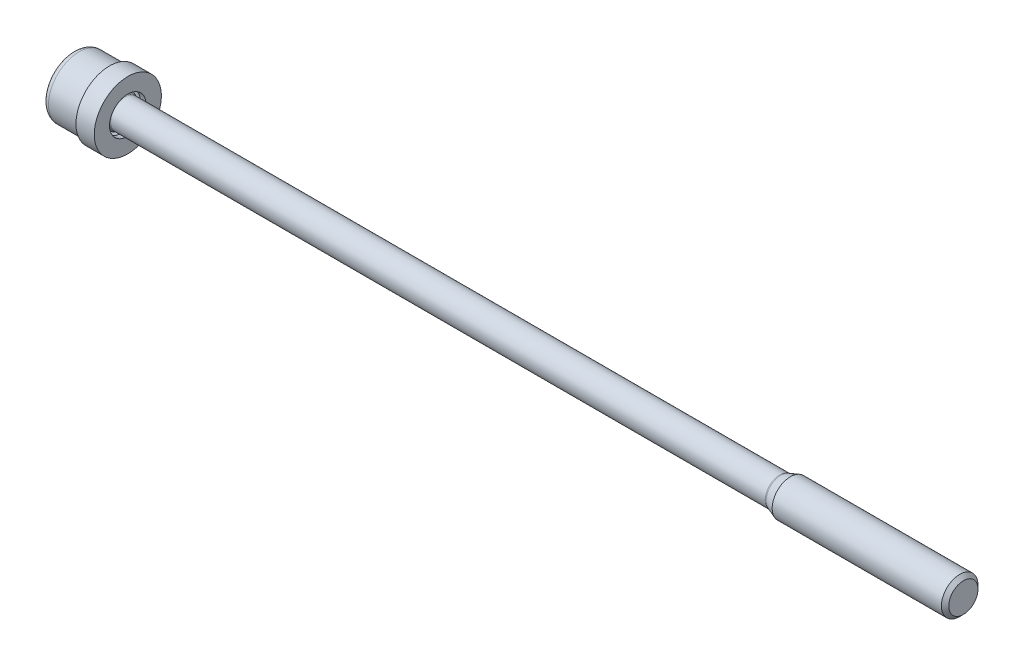
ISO-10303-21;
HEADER;
FILE_DESCRIPTION(('STEP AP214'),'2;1');
FILE_NAME('part.step','',(''),(''),'','','');
FILE_SCHEMA(('AUTOMOTIVE_DESIGN { 1 0 10303 214 1 1 1 1 }'));
ENDSEC;
DATA;
#1=APPLICATION_CONTEXT('core data for automotive mechanical design processes');
#2=APPLICATION_PROTOCOL_DEFINITION('international standard','automotive_design',2000,#1);
#3=PRODUCT_CONTEXT('',#1,'mechanical');
#4=PRODUCT('Part','Part','',(#3));
#5=PRODUCT_RELATED_PRODUCT_CATEGORY('part','',(#4));
#6=PRODUCT_DEFINITION_FORMATION('','',#4);
#7=PRODUCT_DEFINITION_CONTEXT('part definition',#1,'design');
#8=PRODUCT_DEFINITION('design','',#6,#7);
#9=PRODUCT_DEFINITION_SHAPE('','',#8);
#10=(LENGTH_UNIT() NAMED_UNIT(*) SI_UNIT(.MILLI.,.METRE.));
#11=(NAMED_UNIT(*) PLANE_ANGLE_UNIT() SI_UNIT($,.RADIAN.));
#12=(NAMED_UNIT(*) SI_UNIT($,.STERADIAN.) SOLID_ANGLE_UNIT());
#13=UNCERTAINTY_MEASURE_WITH_UNIT(LENGTH_MEASURE(1.E-05),#10,'distance_accuracy_value','');
#14=(GEOMETRIC_REPRESENTATION_CONTEXT(3) GLOBAL_UNCERTAINTY_ASSIGNED_CONTEXT((#13)) GLOBAL_UNIT_ASSIGNED_CONTEXT((#10,
#11,#12)) REPRESENTATION_CONTEXT('',''));
#15=CARTESIAN_POINT('',(0.,0.,0.));
#16=DIRECTION('',(0.,0.,1.));
#17=DIRECTION('',(1.,0.,0.));
#18=AXIS2_PLACEMENT_3D('',#15,#16,#17);
#19=CARTESIAN_POINT('',(6.,3.75,0.));
#20=DIRECTION('',(1.,0.,0.));
#21=DIRECTION('',(0.,0.,-1.));
#22=AXIS2_PLACEMENT_3D('',#19,#20,#21);
#23=PLANE('',#22);
#24=CARTESIAN_POINT('',(6.,0.,0.));
#25=DIRECTION('',(-1.,0.,0.));
#26=DIRECTION('',(0.,0.,1.));
#27=AXIS2_PLACEMENT_3D('',#24,#25,#26);
#28=CIRCLE('',#27,3.75);
#29=CARTESIAN_POINT('',(6.,0.,3.75));
#30=VERTEX_POINT('',#29);
#31=EDGE_CURVE('E63',#30,#30,#28,.T.);
#32=ORIENTED_EDGE('',*,*,#31,.F.);
#33=EDGE_LOOP('',(#32));
#34=FACE_BOUND('',#33,.T.);
#35=CARTESIAN_POINT('',(6.,0.,0.));
#36=DIRECTION('',(-1.,0.,0.));
#37=DIRECTION('',(0.,0.,1.));
#38=AXIS2_PLACEMENT_3D('',#35,#36,#37);
#39=CIRCLE('',#38,5.5);
#40=CARTESIAN_POINT('',(6.,0.,5.5));
#41=VERTEX_POINT('',#40);
#42=EDGE_CURVE('E11',#41,#41,#39,.T.);
#43=ORIENTED_EDGE('',*,*,#42,.T.);
#44=EDGE_LOOP('',(#43));
#45=FACE_BOUND('',#44,.T.);
#46=ADVANCED_FACE('F44',(#34,#45),#23,.F.);
#47=CARTESIAN_POINT('',(0.,0.,0.));
#48=DIRECTION('',(-1.,0.,0.));
#49=DIRECTION('',(0.,0.,1.));
#50=AXIS2_PLACEMENT_3D('',#47,#48,#49);
#51=CYLINDRICAL_SURFACE('',#50,5.5);
#52=ORIENTED_EDGE('',*,*,#42,.F.);
#53=EDGE_LOOP('',(#52));
#54=FACE_BOUND('',#53,.T.);
#55=CARTESIAN_POINT('',(9.,0.,0.));
#56=DIRECTION('',(-1.,0.,0.));
#57=DIRECTION('',(0.,0.,1.));
#58=AXIS2_PLACEMENT_3D('',#55,#56,#57);
#59=CIRCLE('',#58,5.5);
#60=CARTESIAN_POINT('',(9.,0.,5.5));
#61=VERTEX_POINT('',#60);
#62=EDGE_CURVE('E50',#61,#61,#59,.T.);
#63=ORIENTED_EDGE('',*,*,#62,.T.);
#64=EDGE_LOOP('',(#63));
#65=FACE_BOUND('',#64,.T.);
#66=ADVANCED_FACE('F70',(#54,#65),#51,.T.);
#67=CARTESIAN_POINT('',(9.,5.5,0.));
#68=DIRECTION('',(-1.,0.,0.));
#69=DIRECTION('',(0.,0.,1.));
#70=AXIS2_PLACEMENT_3D('',#67,#68,#69);
#71=PLANE('',#70);
#72=ORIENTED_EDGE('',*,*,#62,.F.);
#73=EDGE_LOOP('',(#72));
#74=FACE_BOUND('',#73,.T.);
#75=CARTESIAN_POINT('',(9.,0.,0.));
#76=DIRECTION('',(-1.,0.,0.));
#77=DIRECTION('',(0.,0.,1.));
#78=AXIS2_PLACEMENT_3D('',#75,#76,#77);
#79=CIRCLE('',#78,3.);
#80=CARTESIAN_POINT('',(9.,0.,3.));
#81=VERTEX_POINT('',#80);
#82=EDGE_CURVE('E54',#81,#81,#79,.T.);
#83=ORIENTED_EDGE('',*,*,#82,.T.);
#84=EDGE_LOOP('',(#83));
#85=FACE_BOUND('',#84,.T.);
#86=ADVANCED_FACE('F74',(#74,#85),#71,.F.);
#87=CARTESIAN_POINT('',(0.,0.,0.));
#88=DIRECTION('',(-1.,0.,0.));
#89=DIRECTION('',(0.,0.,1.));
#90=AXIS2_PLACEMENT_3D('',#87,#88,#89);
#91=CYLINDRICAL_SURFACE('',#90,3.);
#92=ORIENTED_EDGE('',*,*,#82,.F.);
#93=EDGE_LOOP('',(#92));
#94=FACE_BOUND('',#93,.T.);
#95=CARTESIAN_POINT('',(8.06060806459101,0.,0.));
#96=DIRECTION('',(-1.,0.,0.));
#97=DIRECTION('',(0.,0.,1.));
#98=AXIS2_PLACEMENT_3D('',#95,#96,#97);
#99=CIRCLE('',#98,3.);
#100=CARTESIAN_POINT('',(8.06060806459101,0.,3.));
#101=VERTEX_POINT('',#100);
#102=EDGE_CURVE('E58',#101,#101,#99,.T.);
#103=ORIENTED_EDGE('',*,*,#102,.T.);
#104=EDGE_LOOP('',(#103));
#105=FACE_BOUND('',#104,.T.);
#106=ADVANCED_FACE('F79',(#94,#105),#91,.F.);
#107=CARTESIAN_POINT('',(6.,0.,0.));
#108=DIRECTION('',(-1.,0.,0.));
#109=DIRECTION('',(0.,0.,1.));
#110=AXIS2_PLACEMENT_3D('',#107,#108,#109);
#111=CONICAL_SURFACE('',#110,3.75,0.34906585039886);
#112=ORIENTED_EDGE('',*,*,#102,.F.);
#113=EDGE_LOOP('',(#112));
#114=FACE_BOUND('',#113,.T.);
#115=ORIENTED_EDGE('',*,*,#31,.T.);
#116=EDGE_LOOP('',(#115));
#117=FACE_BOUND('',#116,.T.);
#118=ADVANCED_FACE('F67',(#114,#117),#111,.F.);
#119=CLOSED_SHELL('',(#46,#66,#86,#106,#118));
#120=MANIFOLD_SOLID_BREP('B2',#119);
#121=CARTESIAN_POINT('',(0.,3.,0.));
#122=DIRECTION('',(-1.,0.,0.));
#123=DIRECTION('',(0.,0.,1.));
#124=AXIS2_PLACEMENT_3D('',#121,#122,#123);
#125=PLANE('',#124);
#126=CARTESIAN_POINT('',(0.,0.,0.));
#127=DIRECTION('',(-1.,0.,0.));
#128=DIRECTION('',(0.,0.,1.));
#129=AXIS2_PLACEMENT_3D('',#126,#127,#128);
#130=CIRCLE('',#129,4.);
#131=CARTESIAN_POINT('',(0.,0.,4.));
#132=VERTEX_POINT('',#131);
#133=EDGE_CURVE('E332',#132,#132,#130,.T.);
#134=ORIENTED_EDGE('',*,*,#133,.T.);
#135=EDGE_LOOP('',(#134));
#136=FACE_BOUND('',#135,.T.);
#137=DIRECTION('',(0.,-0.866025403784439,-0.5));
#138=VECTOR('',#137,1.);
#139=CARTESIAN_POINT('',(0.,2.5,-1.44337567297406));
#140=LINE('',#139,#138);
#141=CARTESIAN_POINT('',(0.,2.5,-1.44337567297406));
#142=VERTEX_POINT('',#141);
#143=CARTESIAN_POINT('',(0.,0.,-2.88675134594813));
#144=VERTEX_POINT('',#143);
#145=EDGE_CURVE('E190',#142,#144,#140,.T.);
#146=ORIENTED_EDGE('',*,*,#145,.F.);
#147=DIRECTION('',(0.,0.,-1.));
#148=VECTOR('',#147,1.);
#149=CARTESIAN_POINT('',(0.,2.5,1.44337567297407));
#150=LINE('',#149,#148);
#151=CARTESIAN_POINT('',(0.,2.5,1.44337567297407));
#152=VERTEX_POINT('',#151);
#153=EDGE_CURVE('E202',#152,#142,#150,.T.);
#154=ORIENTED_EDGE('',*,*,#153,.F.);
#155=DIRECTION('',(0.,0.866025403784439,-0.5));
#156=VECTOR('',#155,1.);
#157=CARTESIAN_POINT('',(0.,0.,2.88675134594813));
#158=LINE('',#157,#156);
#159=CARTESIAN_POINT('',(0.,0.,2.88675134594813));
#160=VERTEX_POINT('',#159);
#161=EDGE_CURVE('E196',#160,#152,#158,.T.);
#162=ORIENTED_EDGE('',*,*,#161,.F.);
#163=DIRECTION('',(0.,0.866025403784438,0.5));
#164=VECTOR('',#163,1.);
#165=CARTESIAN_POINT('',(0.,-2.5,1.44337567297406));
#166=LINE('',#165,#164);
#167=CARTESIAN_POINT('',(0.,-2.5,1.44337567297406));
#168=VERTEX_POINT('',#167);
#169=EDGE_CURVE('E194',#168,#160,#166,.T.);
#170=ORIENTED_EDGE('',*,*,#169,.F.);
#171=DIRECTION('',(0.,0.,1.));
#172=VECTOR('',#171,1.);
#173=CARTESIAN_POINT('',(0.,-2.5,-1.44337567297407));
#174=LINE('',#173,#172);
#175=CARTESIAN_POINT('',(0.,-2.5,-1.44337567297407));
#176=VERTEX_POINT('',#175);
#177=EDGE_CURVE('E177',#176,#168,#174,.T.);
#178=ORIENTED_EDGE('',*,*,#177,.F.);
#179=DIRECTION('',(0.,-0.866025403784439,0.5));
#180=VECTOR('',#179,1.);
#181=CARTESIAN_POINT('',(0.,0.,-2.88675134594813));
#182=LINE('',#181,#180);
#183=EDGE_CURVE('E185',#144,#176,#182,.T.);
#184=ORIENTED_EDGE('',*,*,#183,.F.);
#185=EDGE_LOOP('',(#146,#154,#162,#170,#178,#184));
#186=FACE_BOUND('',#185,.T.);
#187=ADVANCED_FACE('F120',(#136,#186),#125,.T.);
#188=CARTESIAN_POINT('',(0.,0.,0.));
#189=DIRECTION('',(1.,0.,0.));
#190=DIRECTION('',(0.,0.,-1.));
#191=AXIS2_PLACEMENT_3D('',#188,#189,#190);
#192=CYLINDRICAL_SURFACE('',#191,5.);
#193=CARTESIAN_POINT('',(1.,0.,0.));
#194=DIRECTION('',(-1.,0.,0.));
#195=DIRECTION('',(0.,0.,1.));
#196=AXIS2_PLACEMENT_3D('',#193,#194,#195);
#197=CIRCLE('',#196,5.);
#198=CARTESIAN_POINT('',(1.,0.,5.));
#199=VERTEX_POINT('',#198);
#200=EDGE_CURVE('E342',#199,#199,#197,.F.);
#201=ORIENTED_EDGE('',*,*,#200,.T.);
#202=EDGE_LOOP('',(#201));
#203=FACE_BOUND('',#202,.T.);
#204=CARTESIAN_POINT('',(6.,0.,0.));
#205=DIRECTION('',(1.,0.,0.));
#206=DIRECTION('',(0.,0.,-1.));
#207=AXIS2_PLACEMENT_3D('',#204,#205,#206);
#208=CIRCLE('',#207,5.);
#209=CARTESIAN_POINT('',(6.,0.,-5.));
#210=VERTEX_POINT('',#209);
#211=EDGE_CURVE('E345',#210,#210,#208,.T.);
#212=ORIENTED_EDGE('',*,*,#211,.F.);
#213=EDGE_LOOP('',(#212));
#214=FACE_BOUND('',#213,.T.);
#215=ADVANCED_FACE('F297',(#203,#214),#192,.T.);
#216=CARTESIAN_POINT('',(6.,5.,0.));
#217=DIRECTION('',(1.,0.,0.));
#218=DIRECTION('',(0.,0.,-1.));
#219=AXIS2_PLACEMENT_3D('',#216,#217,#218);
#220=PLANE('',#219);
#221=CARTESIAN_POINT('',(6.,0.,0.));
#222=DIRECTION('',(1.,0.,0.));
#223=DIRECTION('',(0.,0.,-1.));
#224=AXIS2_PLACEMENT_3D('',#221,#222,#223);
#225=CIRCLE('',#224,3.66002935477036);
#226=CARTESIAN_POINT('',(6.,0.,-3.66002935477036));
#227=VERTEX_POINT('',#226);
#228=EDGE_CURVE('E42',#227,#227,#225,.F.);
#229=ORIENTED_EDGE('',*,*,#228,.T.);
#230=EDGE_LOOP('',(#229));
#231=FACE_BOUND('',#230,.T.);
#232=ORIENTED_EDGE('',*,*,#211,.T.);
#233=EDGE_LOOP('',(#232));
#234=FACE_BOUND('',#233,.T.);
#235=ADVANCED_FACE('F293',(#231,#234),#220,.T.);
#236=CARTESIAN_POINT('',(8.5,0.,0.));
#237=DIRECTION('',(-1.,0.,0.));
#238=DIRECTION('',(0.,0.,1.));
#239=AXIS2_PLACEMENT_3D('',#236,#237,#238);
#240=CONICAL_SURFACE('',#239,2.4,0.349065850398867);
#241=CARTESIAN_POINT('',(8.4171534186914,0.,0.));
#242=DIRECTION('',(-1.,0.,0.));
#243=DIRECTION('',(0.,0.,1.));
#244=AXIS2_PLACEMENT_3D('',#241,#242,#243);
#245=CIRCLE('',#244,2.43015368960705);
#246=CARTESIAN_POINT('',(8.4171534186914,0.,2.43015368960705));
#247=VERTEX_POINT('',#246);
#248=EDGE_CURVE('E128',#247,#247,#245,.T.);
#249=ORIENTED_EDGE('',*,*,#248,.T.);
#250=EDGE_LOOP('',(#249));
#251=FACE_BOUND('',#250,.T.);
#252=CARTESIAN_POINT('',(6.32898992833717,0.,0.));
#253=DIRECTION('',(-1.,0.,0.));
#254=DIRECTION('',(0.,0.,1.));
#255=AXIS2_PLACEMENT_3D('',#252,#253,#254);
#256=CIRCLE('',#255,3.19018304437741);
#257=CARTESIAN_POINT('',(6.32898992833717,0.,3.19018304437741));
#258=VERTEX_POINT('',#257);
#259=EDGE_CURVE('E329',#258,#258,#256,.F.);
#260=ORIENTED_EDGE('',*,*,#259,.T.);
#261=EDGE_LOOP('',(#260));
#262=FACE_BOUND('',#261,.T.);
#263=ADVANCED_FACE('F289',(#251,#262),#240,.T.);
#264=CARTESIAN_POINT('',(0.,0.,0.));
#265=DIRECTION('',(1.,0.,0.));
#266=DIRECTION('',(0.,0.,-1.));
#267=AXIS2_PLACEMENT_3D('',#264,#265,#266);
#268=CYLINDRICAL_SURFACE('',#267,2.4);
#269=CARTESIAN_POINT('',(115.911836509646,0.,0.));
#270=DIRECTION('',(1.,0.,0.));
#271=DIRECTION('',(0.,0.,-1.));
#272=AXIS2_PLACEMENT_3D('',#269,#270,#271);
#273=CIRCLE('',#272,2.4);
#274=CARTESIAN_POINT('',(115.911836509646,0.,-2.4));
#275=VERTEX_POINT('',#274);
#276=EDGE_CURVE('E325',#275,#275,#273,.F.);
#277=ORIENTED_EDGE('',*,*,#276,.T.);
#278=EDGE_LOOP('',(#277));
#279=FACE_BOUND('',#278,.T.);
#280=CARTESIAN_POINT('',(8.58816349035423,0.,0.));
#281=DIRECTION('',(1.,0.,0.));
#282=DIRECTION('',(0.,0.,-1.));
#283=AXIS2_PLACEMENT_3D('',#280,#281,#282);
#284=CIRCLE('',#283,2.4);
#285=CARTESIAN_POINT('',(8.58816349035423,0.,-2.4));
#286=VERTEX_POINT('',#285);
#287=EDGE_CURVE('E323',#286,#286,#284,.T.);
#288=ORIENTED_EDGE('',*,*,#287,.T.);
#289=EDGE_LOOP('',(#288));
#290=FACE_BOUND('',#289,.T.);
#291=ADVANCED_FACE('F285',(#279,#290),#268,.T.);
#292=CARTESIAN_POINT('',(117.648486451673,0.,0.));
#293=DIRECTION('',(1.,0.,0.));
#294=DIRECTION('',(0.,0.,-1.));
#295=AXIS2_PLACEMENT_3D('',#292,#293,#294);
#296=CONICAL_SURFACE('',#295,3.00000000000001,0.349065850398867);
#297=CARTESIAN_POINT('',(116.082846581309,0.,0.));
#298=DIRECTION('',(1.,0.,0.));
#299=DIRECTION('',(0.,0.,-1.));
#300=AXIS2_PLACEMENT_3D('',#297,#298,#299);
#301=CIRCLE('',#300,2.43015368960705);
#302=CARTESIAN_POINT('',(116.082846581309,0.,-2.43015368960705));
#303=VERTEX_POINT('',#302);
#304=EDGE_CURVE('E326',#303,#303,#301,.T.);
#305=ORIENTED_EDGE('',*,*,#304,.T.);
#306=EDGE_LOOP('',(#305));
#307=FACE_BOUND('',#306,.T.);
#308=CARTESIAN_POINT('',(117.648486451673,0.,0.));
#309=DIRECTION('',(1.,0.,0.));
#310=DIRECTION('',(0.,0.,-1.));
#311=AXIS2_PLACEMENT_3D('',#308,#309,#310);
#312=CIRCLE('',#311,3.00000000000001);
#313=CARTESIAN_POINT('',(117.648486451673,0.,-3.00000000000001));
#314=VERTEX_POINT('',#313);
#315=EDGE_CURVE('E348',#314,#314,#312,.T.);
#316=ORIENTED_EDGE('',*,*,#315,.F.);
#317=EDGE_LOOP('',(#316));
#318=FACE_BOUND('',#317,.T.);
#319=ADVANCED_FACE('F281',(#307,#318),#296,.T.);
#320=CARTESIAN_POINT('',(0.,0.,0.));
#321=DIRECTION('',(1.,0.,0.));
#322=DIRECTION('',(0.,0.,-1.));
#323=AXIS2_PLACEMENT_3D('',#320,#321,#322);
#324=CYLINDRICAL_SURFACE('',#323,3.00000000000001);
#325=ORIENTED_EDGE('',*,*,#315,.T.);
#326=EDGE_LOOP('',(#325));
#327=FACE_BOUND('',#326,.T.);
#328=CARTESIAN_POINT('',(145.4,0.,0.));
#329=DIRECTION('',(1.,0.,0.));
#330=DIRECTION('',(0.,0.,-1.));
#331=AXIS2_PLACEMENT_3D('',#328,#329,#330);
#332=CIRCLE('',#331,3.00000000000001);
#333=CARTESIAN_POINT('',(145.4,0.,-3.00000000000001));
#334=VERTEX_POINT('',#333);
#335=EDGE_CURVE('E350',#334,#334,#332,.T.);
#336=ORIENTED_EDGE('',*,*,#335,.F.);
#337=EDGE_LOOP('',(#336));
#338=FACE_BOUND('',#337,.T.);
#339=ADVANCED_FACE('F277',(#327,#338),#324,.T.);
#340=CARTESIAN_POINT('',(146.,0.,0.));
#341=DIRECTION('',(-1.,0.,0.));
#342=DIRECTION('',(0.,0.,1.));
#343=AXIS2_PLACEMENT_3D('',#340,#341,#342);
#344=CONICAL_SURFACE('',#343,2.4,0.785398163397444);
#345=ORIENTED_EDGE('',*,*,#335,.T.);
#346=EDGE_LOOP('',(#345));
#347=FACE_BOUND('',#346,.T.);
#348=CARTESIAN_POINT('',(146.,0.,0.));
#349=DIRECTION('',(1.,0.,0.));
#350=DIRECTION('',(0.,0.,-1.));
#351=AXIS2_PLACEMENT_3D('',#348,#349,#350);
#352=CIRCLE('',#351,2.4);
#353=CARTESIAN_POINT('',(146.,0.,-2.4));
#354=VERTEX_POINT('',#353);
#355=EDGE_CURVE('E220',#354,#354,#352,.T.);
#356=ORIENTED_EDGE('',*,*,#355,.F.);
#357=EDGE_LOOP('',(#356));
#358=FACE_BOUND('',#357,.T.);
#359=ADVANCED_FACE('F273',(#347,#358),#344,.T.);
#360=CARTESIAN_POINT('',(146.,2.4,0.));
#361=DIRECTION('',(1.,0.,0.));
#362=DIRECTION('',(0.,0.,-1.));
#363=AXIS2_PLACEMENT_3D('',#360,#361,#362);
#364=PLANE('',#363);
#365=ORIENTED_EDGE('',*,*,#355,.T.);
#366=EDGE_LOOP('',(#365));
#367=FACE_BOUND('',#366,.T.);
#368=ADVANCED_FACE('F270',(#367),#364,.T.);
#369=CARTESIAN_POINT('',(146.001,0.,-2.88675134594813));
#370=DIRECTION('',(0.,-0.5,-0.866025403784439));
#371=DIRECTION('',(0.,0.866025403784439,-0.5));
#372=AXIS2_PLACEMENT_3D('',#369,#370,#371);
#373=PLANE('',#372);
#374=DIRECTION('',(-1.,0.,0.));
#375=VECTOR('',#374,1.);
#376=CARTESIAN_POINT('',(146.001,-2.5,-1.44337567297407));
#377=LINE('',#376,#375);
#378=CARTESIAN_POINT('',(3.06538414090221,-2.5,-1.44337567297407));
#379=VERTEX_POINT('',#378);
#380=EDGE_CURVE('E173',#379,#176,#377,.T.);
#381=ORIENTED_EDGE('',*,*,#380,.F.);
#382=CARTESIAN_POINT('',(3.0653174702357,-2.5002,-1.44326020292023));
#383=CARTESIAN_POINT('',(3.10195351448719,-2.39033676526513,-1.50668977106845));
#384=CARTESIAN_POINT('',(3.13527291562976,-2.27952520010347,-1.57066685804385));
#385=CARTESIAN_POINT('',(3.19343284903695,-2.05598316653395,-1.69972891130041));
#386=CARTESIAN_POINT('',(3.21825280544707,-1.94324872547161,-1.7648161711947));
#387=CARTESIAN_POINT('',(3.25688948315376,-1.71917700612473,-1.8941840386774));
#388=CARTESIAN_POINT('',(3.27096333840917,-1.60787420823262,-1.95844473900197));
#389=CARTESIAN_POINT('',(3.28776598224206,-1.38474477253167,-2.08726857876804));
#390=CARTESIAN_POINT('',(3.29050868339118,-1.27291894598577,-2.15183124982667));
#391=CARTESIAN_POINT('',(3.28480937458676,-1.06395802444848,-2.27247489412634));
#392=CARTESIAN_POINT('',(3.27776674021295,-0.966791682442269,-2.32857390783979));
#393=CARTESIAN_POINT('',(3.25544371546987,-0.773092050288997,-2.44040644260542));
#394=CARTESIAN_POINT('',(3.24015569615454,-0.676559430340267,-2.4961395767184));
#395=CARTESIAN_POINT('',(3.20193604075039,-0.482460278259523,-2.60820277442169));
#396=CARTESIAN_POINT('',(3.1788423584693,-0.384918318217859,-2.66451865130903));
#397=CARTESIAN_POINT('',(3.1264284780169,-0.191289391923914,-2.77631036402774));
#398=CARTESIAN_POINT('',(3.09712059897026,-0.0951999441138231,-2.83178763258718));
#399=CARTESIAN_POINT('',(3.0653174702357,0.000200000000001002,-2.88686681600197));
#400=B_SPLINE_CURVE_WITH_KNOTS('',3,(#382,#383,#384,#385,#386,#387,#388,#389,#390,#391,#392,
#393,#394,#395,#396,#397,#398,#399),.UNSPECIFIED.,.F.,.F.,(4,2,2,2,2,2,2,2,4),(0.,
0.396285827362226,0.79352433015205,1.18093086852114,1.56786160134475,1.90479741793733,
2.24204551660463,2.58677531536756,2.93082800105256),.UNSPECIFIED.);
#401=CARTESIAN_POINT('',(3.06538414090221,0.,-2.88675134594813));
#402=VERTEX_POINT('',#401);
#403=EDGE_CURVE('E135',#379,#402,#400,.T.);
#404=ORIENTED_EDGE('',*,*,#403,.T.);
#405=DIRECTION('',(-1.,0.,0.));
#406=VECTOR('',#405,1.);
#407=CARTESIAN_POINT('',(146.001,0.,-2.88675134594813));
#408=LINE('',#407,#406);
#409=EDGE_CURVE('E182',#402,#144,#408,.T.);
#410=ORIENTED_EDGE('',*,*,#409,.T.);
#411=ORIENTED_EDGE('',*,*,#183,.T.);
#412=EDGE_LOOP('',(#381,#404,#410,#411));
#413=FACE_BOUND('',#412,.T.);
#414=ADVANCED_FACE('F186',(#413),#373,.F.);
#415=CARTESIAN_POINT('',(146.001,-2.5,-1.44337567297407));
#416=DIRECTION('',(0.,-1.,0.));
#417=DIRECTION('',(0.,0.,-1.));
#418=AXIS2_PLACEMENT_3D('',#415,#416,#417);
#419=PLANE('',#418);
#420=DIRECTION('',(-1.,0.,0.));
#421=VECTOR('',#420,1.);
#422=CARTESIAN_POINT('',(146.001,-2.5,1.44337567297406));
#423=LINE('',#422,#421);
#424=CARTESIAN_POINT('',(3.06538414090221,-2.5,1.44337567297406));
#425=VERTEX_POINT('',#424);
#426=EDGE_CURVE('E181',#425,#168,#423,.T.);
#427=ORIENTED_EDGE('',*,*,#426,.F.);
#428=CARTESIAN_POINT('',(2.12636842345551,-2.5,-3.75749145849147));
#429=CARTESIAN_POINT('',(2.17840730126994,-2.5,-3.64919841245765));
#430=CARTESIAN_POINT('',(2.22991109081443,-2.5,-3.54064339523085));
#431=CARTESIAN_POINT('',(2.33154466807991,-2.5,-3.3228694955171));
#432=CARTESIAN_POINT('',(2.38167421161515,-2.5,-3.21365049920821));
#433=CARTESIAN_POINT('',(2.4805337544965,-2.5,-2.99378661217995));
#434=CARTESIAN_POINT('',(2.52925350352944,-2.5,-2.88313709525642));
#435=CARTESIAN_POINT('',(2.62453076962273,-2.5,-2.66091438051196));
#436=CARTESIAN_POINT('',(2.67108839828446,-2.5,-2.54934123071691));
#437=CARTESIAN_POINT('',(2.76268020358821,-2.5,-2.32208129370502));
#438=CARTESIAN_POINT('',(2.80764011051455,-2.5,-2.20636439807093));
#439=CARTESIAN_POINT('',(2.8938583204999,-2.5,-1.97353370647439));
#440=CARTESIAN_POINT('',(2.93511619281195,-2.5,-1.85641974974959));
#441=CARTESIAN_POINT('',(3.01275931437895,-2.5,-1.62086916274625));
#442=CARTESIAN_POINT('',(3.04915554799201,-2.5,-1.5024361923926));
#443=CARTESIAN_POINT('',(3.11583031127494,-2.5,-1.26387801946515));
#444=CARTESIAN_POINT('',(3.14611089728492,-2.5,-1.14375340027707));
#445=CARTESIAN_POINT('',(3.1988834258473,-2.5,-0.902338315637485));
#446=CARTESIAN_POINT('',(3.22140975998488,-2.5,-0.781055515829784));
#447=CARTESIAN_POINT('',(3.25730646557173,-2.5,-0.537116621010969));
#448=CARTESIAN_POINT('',(3.27067748885287,-2.5,-0.414460624399614));
#449=CARTESIAN_POINT('',(3.287022334139,-2.5,-0.169933632334297));
#450=CARTESIAN_POINT('',(3.29012016324679,-2.5,-0.0480711308396707));
#451=CARTESIAN_POINT('',(3.28597573178245,-2.5,0.19548591265525));
#452=CARTESIAN_POINT('',(3.27873285516471,-2.5,0.317180444216426));
#453=CARTESIAN_POINT('',(3.25777388069378,-2.5,0.527456408829613));
#454=CARTESIAN_POINT('',(3.24628060785313,-2.5,0.616270494700837));
#455=CARTESIAN_POINT('',(3.21857052983102,-2.5,0.793165661516789));
#456=CARTESIAN_POINT('',(3.20235297879511,-2.5,0.881246624458082));
#457=CARTESIAN_POINT('',(3.14747296332912,-2.5,1.14430390665101));
#458=CARTESIAN_POINT('',(3.1025954799091,-2.5,1.317984412454));
#459=CARTESIAN_POINT('',(2.99987041239151,-2.5,1.66560393982868));
#460=CARTESIAN_POINT('',(2.94175242280195,-2.5,1.83945995399085));
#461=CARTESIAN_POINT('',(2.84820982121638,-2.5,2.09786165724551));
#462=CARTESIAN_POINT('',(2.81597294206815,-2.5,2.18358675226303));
#463=CARTESIAN_POINT('',(2.74971773361361,-2.5,2.35434488656641));
#464=CARTESIAN_POINT('',(2.71569943468296,-2.5,2.43937793762404));
#465=CARTESIAN_POINT('',(2.62609143927397,-2.5,2.65783078906444));
#466=CARTESIAN_POINT('',(2.56940246137258,-2.5,2.79079865626203));
#467=CARTESIAN_POINT('',(2.45324874031999,-2.5,3.05552029876381));
#468=CARTESIAN_POINT('',(2.39378378784884,-2.5,3.18727398161362));
#469=CARTESIAN_POINT('',(2.27270940087484,-2.5,3.44982929016523));
#470=CARTESIAN_POINT('',(2.21109943532155,-2.5,3.58063067026957));
#471=CARTESIAN_POINT('',(2.08621423183453,-2.5,3.84143730957473));
#472=CARTESIAN_POINT('',(2.02293895605817,-2.5,3.97144255060114));
#473=CARTESIAN_POINT('',(1.83100339380671,-2.5,4.36080606143232));
#474=CARTESIAN_POINT('',(1.70038124495656,-2.5,4.61919627423268));
#475=CARTESIAN_POINT('',(1.43577817267015,-2.5,5.13419069650057));
#476=CARTESIAN_POINT('',(1.30179775266331,-2.5,5.39079516638233));
#477=CARTESIAN_POINT('',(1.04443333112509,-2.5,5.87829290077643));
#478=CARTESIAN_POINT('',(0.921261270423659,-2.5,6.1092982358284));
#479=CARTESIAN_POINT('',(0.673512402732434,-2.5,6.57056638390016));
#480=CARTESIAN_POINT('',(0.548935533926602,-2.5,6.8008291636673));
#481=CARTESIAN_POINT('',(0.299056267226439,-2.5,7.26018235458172));
#482=CARTESIAN_POINT('',(0.173756607898793,-2.5,7.48927425711587));
#483=CARTESIAN_POINT('',(-0.0776565907082638,-2.5,7.94699348590568));
#484=CARTESIAN_POINT('',(-0.203770081171649,-2.5,8.1756208389644));
#485=CARTESIAN_POINT('',(-0.33018177744971,-2.5,8.40408211730898));
#486=B_SPLINE_CURVE_WITH_KNOTS('',3,(#428,#429,#430,#431,#432,#433,#434,#435,#436,#437,#438,
#439,#440,#441,#442,#443,#444,#445,#446,#447,#448,#449,#450,#451,#452,#453,#454,#455,#456,#457,
#458,#459,#460,#461,#462,#463,#464,#465,#466,#467,#468,#469,#470,#471,#472,#473,#474,#475,#476,
#477,#478,#479,#480,#481,#482,#483,#484,#485),.UNSPECIFIED.,.F.,.F.,(4,2,2,2,2,2,2,2,2,2,2,2,2,
2,2,2,2,2,2,2,2,2,2,2,2,2,2,2,4),(0.,0.360447630601902,0.720958898327138,1.08364194517046,
1.44630625067838,1.81869010849736,2.19111723867755,2.56268813804158,2.93413389074121,
3.30391031832936,3.6736604161591,4.03893071561303,4.40422277688467,4.67275529541628,
4.94133023203033,5.478811279852,6.02844936413291,6.30319202048782,6.57792999362449,
7.01152865074963,7.44516005598384,7.87889959153572,8.31264899193852,9.18119380679301,
10.0496091900455,10.8349772933876,11.6203800913395,12.4037350974485,13.1870435444301),.UNSPECIFIED.);
#487=EDGE_CURVE('E180',#425,#379,#486,.F.);
#488=ORIENTED_EDGE('',*,*,#487,.T.);
#489=ORIENTED_EDGE('',*,*,#380,.T.);
#490=ORIENTED_EDGE('',*,*,#177,.T.);
#491=EDGE_LOOP('',(#427,#488,#489,#490));
#492=FACE_BOUND('',#491,.T.);
#493=ADVANCED_FACE('F175',(#492),#419,.F.);
#494=CARTESIAN_POINT('',(146.001,-2.5,1.44337567297406));
#495=DIRECTION('',(0.,-0.5,0.866025403784439));
#496=DIRECTION('',(0.,-0.866025403784438,-0.5));
#497=AXIS2_PLACEMENT_3D('',#494,#495,#496);
#498=PLANE('',#497);
#499=DIRECTION('',(-1.,0.,0.));
#500=VECTOR('',#499,1.);
#501=CARTESIAN_POINT('',(146.001,0.,2.88675134594813));
#502=LINE('',#501,#500);
#503=CARTESIAN_POINT('',(3.06538414090221,0.,2.88675134594813));
#504=VERTEX_POINT('',#503);
#505=EDGE_CURVE('E209',#504,#160,#502,.T.);
#506=ORIENTED_EDGE('',*,*,#505,.F.);
#507=CARTESIAN_POINT('',(3.0653174702357,0.000200000000001156,2.88686681600197));
#508=CARTESIAN_POINT('',(3.10195351448719,-0.10966323473487,2.82343724785375));
#509=CARTESIAN_POINT('',(3.13527291562976,-0.220474799896524,2.75946016087834));
#510=CARTESIAN_POINT('',(3.19343284903695,-0.444016833466048,2.63039810762178));
#511=CARTESIAN_POINT('',(3.21825280544707,-0.556751274528387,2.5653108477275));
#512=CARTESIAN_POINT('',(3.25688948315376,-0.780822993875267,2.43594298024479));
#513=CARTESIAN_POINT('',(3.27096333840917,-0.892125791767375,2.37168227992023));
#514=CARTESIAN_POINT('',(3.28776598224206,-1.11525522746833,2.24285844015415));
#515=CARTESIAN_POINT('',(3.29050868339119,-1.22708105401423,2.17829576909553));
#516=CARTESIAN_POINT('',(3.28480937458676,-1.43604197555152,2.05765212479586));
#517=CARTESIAN_POINT('',(3.27776674021295,-1.53320831755773,2.0015531110824));
#518=CARTESIAN_POINT('',(3.25544371546987,-1.726907949711,1.88972057631678));
#519=CARTESIAN_POINT('',(3.24015569615455,-1.82344056965973,1.8339874422038));
#520=CARTESIAN_POINT('',(3.20193604075039,-2.01753972174047,1.7219242445005));
#521=CARTESIAN_POINT('',(3.1788423584693,-2.11508168178214,1.66560836761316));
#522=CARTESIAN_POINT('',(3.1264284780169,-2.30871060807608,1.55381665489446));
#523=CARTESIAN_POINT('',(3.09712059897026,-2.40480005588618,1.49833938633502));
#524=CARTESIAN_POINT('',(3.0653174702357,-2.5002,1.44326020292023));
#525=B_SPLINE_CURVE_WITH_KNOTS('',3,(#507,#508,#509,#510,#511,#512,#513,#514,#515,#516,#517,
#518,#519,#520,#521,#522,#523,#524),.UNSPECIFIED.,.F.,.F.,(4,2,2,2,2,2,2,2,4),(0.,
0.396285827362227,0.793524330152051,1.18093086852114,1.56786160134475,1.90479741793733,
2.24204551660463,2.58677531536756,2.93082800105256),.UNSPECIFIED.);
#526=EDGE_CURVE('E241',#504,#425,#525,.T.);
#527=ORIENTED_EDGE('',*,*,#526,.T.);
#528=ORIENTED_EDGE('',*,*,#426,.T.);
#529=ORIENTED_EDGE('',*,*,#169,.T.);
#530=EDGE_LOOP('',(#506,#527,#528,#529));
#531=FACE_BOUND('',#530,.T.);
#532=ADVANCED_FACE('F371',(#531),#498,.F.);
#533=CARTESIAN_POINT('',(146.001,0.,2.88675134594813));
#534=DIRECTION('',(0.,0.5,0.866025403784439));
#535=DIRECTION('',(0.,-0.866025403784439,0.5));
#536=AXIS2_PLACEMENT_3D('',#533,#534,#535);
#537=PLANE('',#536);
#538=DIRECTION('',(-1.,0.,0.));
#539=VECTOR('',#538,1.);
#540=CARTESIAN_POINT('',(146.001,2.5,1.44337567297407));
#541=LINE('',#540,#539);
#542=CARTESIAN_POINT('',(3.06538414090221,2.5,1.44337567297407));
#543=VERTEX_POINT('',#542);
#544=EDGE_CURVE('E207',#543,#152,#541,.T.);
#545=ORIENTED_EDGE('',*,*,#544,.F.);
#546=CARTESIAN_POINT('',(3.0653174702357,2.5002,1.44326020292023));
#547=CARTESIAN_POINT('',(3.10195351448719,2.39033676526513,1.50668977106845));
#548=CARTESIAN_POINT('',(3.13527291562976,2.27952520010348,1.57066685804385));
#549=CARTESIAN_POINT('',(3.19343284903695,2.05598316653395,1.69972891130042));
#550=CARTESIAN_POINT('',(3.21825280544707,1.94324872547161,1.7648161711947));
#551=CARTESIAN_POINT('',(3.25688948315376,1.71917700612473,1.8941840386774));
#552=CARTESIAN_POINT('',(3.27096333840917,1.60787420823262,1.95844473900197));
#553=CARTESIAN_POINT('',(3.28776598224206,1.38474477253167,2.08726857876805));
#554=CARTESIAN_POINT('',(3.29050868339118,1.27291894598577,2.15183124982667));
#555=CARTESIAN_POINT('',(3.28480937458676,1.06395802444848,2.27247489412634));
#556=CARTESIAN_POINT('',(3.27776674021295,0.966791682442269,2.32857390783979));
#557=CARTESIAN_POINT('',(3.25544371546987,0.773092050288998,2.44040644260542));
#558=CARTESIAN_POINT('',(3.24015569615454,0.676559430340268,2.4961395767184));
#559=CARTESIAN_POINT('',(3.20193604075039,0.482460278259525,2.60820277442169));
#560=CARTESIAN_POINT('',(3.1788423584693,0.38491831821786,2.66451865130903));
#561=CARTESIAN_POINT('',(3.1264284780169,0.191289391923916,2.77631036402774));
#562=CARTESIAN_POINT('',(3.09712059897026,0.0951999441138252,2.83178763258718));
#563=CARTESIAN_POINT('',(3.0653174702357,-0.000199999999998701,2.88686681600197));
#564=B_SPLINE_CURVE_WITH_KNOTS('',3,(#546,#547,#548,#549,#550,#551,#552,#553,#554,#555,#556,
#557,#558,#559,#560,#561,#562,#563),.UNSPECIFIED.,.F.,.F.,(4,2,2,2,2,2,2,2,4),(0.,
0.396285827362227,0.793524330152051,1.18093086852114,1.56786160134475,1.90479741793733,
2.24204551660463,2.58677531536756,2.93082800105256),.UNSPECIFIED.);
#565=EDGE_CURVE('E247',#543,#504,#564,.T.);
#566=ORIENTED_EDGE('',*,*,#565,.T.);
#567=ORIENTED_EDGE('',*,*,#505,.T.);
#568=ORIENTED_EDGE('',*,*,#161,.T.);
#569=EDGE_LOOP('',(#545,#566,#567,#568));
#570=FACE_BOUND('',#569,.T.);
#571=ADVANCED_FACE('F361',(#570),#537,.F.);
#572=CARTESIAN_POINT('',(146.001,2.5,1.44337567297407));
#573=DIRECTION('',(0.,1.,0.));
#574=DIRECTION('',(0.,0.,1.));
#575=AXIS2_PLACEMENT_3D('',#572,#573,#574);
#576=PLANE('',#575);
#577=DIRECTION('',(-1.,0.,0.));
#578=VECTOR('',#577,1.);
#579=CARTESIAN_POINT('',(146.001,2.5,-1.44337567297406));
#580=LINE('',#579,#578);
#581=CARTESIAN_POINT('',(3.06538414090221,2.5,-1.44337567297406));
#582=VERTEX_POINT('',#581);
#583=EDGE_CURVE('E205',#582,#142,#580,.T.);
#584=ORIENTED_EDGE('',*,*,#583,.F.);
#585=CARTESIAN_POINT('',(2.12636842374781,2.5,-3.75749145788336));
#586=CARTESIAN_POINT('',(2.17840730154986,2.5,-3.64919841186993));
#587=CARTESIAN_POINT('',(2.22991109108197,2.5,-3.54064339466354));
#588=CARTESIAN_POINT('',(2.33154466832276,2.5,-3.32286949499067));
#589=CARTESIAN_POINT('',(2.38167421184568,2.5,-3.21365049870226));
#590=CARTESIAN_POINT('',(2.48053375470237,2.5,-2.99378661171531));
#591=CARTESIAN_POINT('',(2.52925350372298,2.5,-2.88313709481262));
#592=CARTESIAN_POINT('',(2.6245307697918,2.5,-2.66091438011));
#593=CARTESIAN_POINT('',(2.67108839844142,2.5,-2.54934123033594));
#594=CARTESIAN_POINT('',(2.76268020372084,2.5,-2.32208129336721));
#595=CARTESIAN_POINT('',(2.80764011063499,2.5,-2.2063643977553));
#596=CARTESIAN_POINT('',(2.89385832059665,2.5,-1.9735337062035));
#597=CARTESIAN_POINT('',(2.9351161928972,2.5,-1.85641974950126));
#598=CARTESIAN_POINT('',(3.0127593144424,2.5,-1.62086916254346));
#599=CARTESIAN_POINT('',(3.04915554804515,2.5,-1.5024361922128));
#600=CARTESIAN_POINT('',(3.11583031130928,2.5,-1.26387801933197));
#601=CARTESIAN_POINT('',(3.14611089731076,2.5,-1.14375340016753));
#602=CARTESIAN_POINT('',(3.19888342585617,2.5,-0.902338315588318));
#603=CARTESIAN_POINT('',(3.22140975998604,2.5,-0.781055515817529));
#604=CARTESIAN_POINT('',(3.2573064655632,2.5,-0.537116621073319));
#605=CARTESIAN_POINT('',(3.27067748884234,2.5,-0.414460624499657));
#606=CARTESIAN_POINT('',(3.28702233413111,2.5,-0.16993363250906));
#607=CARTESIAN_POINT('',(3.29012016324342,2.5,-0.0480711310514564));
#608=CARTESIAN_POINT('',(3.28597573179428,2.5,0.195485912370101));
#609=CARTESIAN_POINT('',(3.27873285518723,2.5,0.317180443894937));
#610=CARTESIAN_POINT('',(3.25777388073756,2.5,0.527456408460891));
#611=CARTESIAN_POINT('',(3.24628060790553,2.5,0.616270494320829));
#612=CARTESIAN_POINT('',(3.21857052990114,2.5,0.793165661114662));
#613=CARTESIAN_POINT('',(3.20235297887432,2.5,0.881246624045123));
#614=CARTESIAN_POINT('',(3.14747296343585,2.5,1.14430390620608));
#615=CARTESIAN_POINT('',(3.10259548003446,2.5,1.31798441198846));
#616=CARTESIAN_POINT('',(2.99987041255385,2.5,1.66560393932173));
#617=CARTESIAN_POINT('',(2.94175242298264,2.5,1.8394599534631));
#618=CARTESIAN_POINT('',(2.84820982142381,2.5,2.09786165668668));
#619=CARTESIAN_POINT('',(2.81597294228436,2.5,2.18358675169387));
#620=CARTESIAN_POINT('',(2.74971773384711,2.5,2.3543448859766));
#621=CARTESIAN_POINT('',(2.71569943492498,2.5,2.4393779370239));
#622=CARTESIAN_POINT('',(2.62609143952949,2.5,2.65783078845754));
#623=CARTESIAN_POINT('',(2.56940246163236,2.5,2.79079865565848));
#624=CARTESIAN_POINT('',(2.4532487405871,2.5,3.05552029816652));
#625=CARTESIAN_POINT('',(2.39378378811902,2.5,3.18727398101926));
#626=CARTESIAN_POINT('',(2.27270940115027,2.5,3.44982928957641));
#627=CARTESIAN_POINT('',(2.21109943559917,2.5,3.58063066968337));
#628=CARTESIAN_POINT('',(2.0862142321159,2.5,3.84143730899351));
#629=CARTESIAN_POINT('',(2.0229389563411,2.5,3.97144255002228));
#630=CARTESIAN_POINT('',(1.83100339409351,2.5,4.36080606086044));
#631=CARTESIAN_POINT('',(1.70038124524498,2.5,4.61919627366512));
#632=CARTESIAN_POINT('',(1.43577817296076,2.5,5.1341906959411));
#633=CARTESIAN_POINT('',(1.30179775295451,2.5,5.39079516582663));
#634=CARTESIAN_POINT('',(1.04443333141861,2.5,5.87829290022415));
#635=CARTESIAN_POINT('',(0.921261270719009,2.5,6.1092982352758));
#636=CARTESIAN_POINT('',(0.67351240303112,2.5,6.57056638334676));
#637=CARTESIAN_POINT('',(0.548935534226794,2.5,6.80082916311342));
#638=CARTESIAN_POINT('',(0.299056267529652,2.5,7.26018235402635));
#639=CARTESIAN_POINT('',(0.173756608203524,2.5,7.48927425655949));
#640=CARTESIAN_POINT('',(-0.077656590400648,2.5,7.94699348534719));
#641=CARTESIAN_POINT('',(-0.203770080862667,2.5,8.1756208384048));
#642=CARTESIAN_POINT('',(-0.330181777139411,2.5,8.40408211674825));
#643=B_SPLINE_CURVE_WITH_KNOTS('',3,(#585,#586,#587,#588,#589,#590,#591,#592,#593,#594,#595,
#596,#597,#598,#599,#600,#601,#602,#603,#604,#605,#606,#607,#608,#609,#610,#611,#612,#613,#614,
#615,#616,#617,#618,#619,#620,#621,#622,#623,#624,#625,#626,#627,#628,#629,#630,#631,#632,#633,
#634,#635,#636,#637,#638,#639,#640,#641,#642),.UNSPECIFIED.,.F.,.F.,(4,2,2,2,2,2,2,2,2,2,2,2,2,
2,2,2,2,2,2,2,2,2,2,2,2,2,2,2,4),(0.,0.360447630530673,0.720958898184668,1.08364194495586,
1.44630625039164,1.81869010813537,2.1911172382403,2.56268813752937,2.93413389015409,
3.30391031762941,3.67366041534648,4.03893071469013,4.4042227758514,4.67275529434612,
4.94133023092328,5.47881127867106,6.02844936287524,6.30319201919188,6.57792999229027,
7.01152864941958,7.44516005465798,7.87889959021417,8.31264899062128,9.1811938054851,
10.0496091887468,10.8349772920855,11.620380090034,12.4037350961382,13.1870435431148),.UNSPECIFIED.);
#644=EDGE_CURVE('E252',#582,#543,#643,.T.);
#645=ORIENTED_EDGE('',*,*,#644,.T.);
#646=ORIENTED_EDGE('',*,*,#544,.T.);
#647=ORIENTED_EDGE('',*,*,#153,.T.);
#648=EDGE_LOOP('',(#584,#645,#646,#647));
#649=FACE_BOUND('',#648,.T.);
#650=ADVANCED_FACE('F227',(#649),#576,.F.);
#651=CARTESIAN_POINT('',(146.001,2.5,-1.44337567297406));
#652=DIRECTION('',(0.,0.5,-0.866025403784439));
#653=DIRECTION('',(0.,0.866025403784439,0.5));
#654=AXIS2_PLACEMENT_3D('',#651,#652,#653);
#655=PLANE('',#654);
#656=ORIENTED_EDGE('',*,*,#409,.F.);
#657=CARTESIAN_POINT('',(3.0653174702357,-0.000199999999998997,-2.88686681600197));
#658=CARTESIAN_POINT('',(3.10195351448719,0.109663234734872,-2.82343724785375));
#659=CARTESIAN_POINT('',(3.13527291562976,0.220474799896527,-2.75946016087834));
#660=CARTESIAN_POINT('',(3.19343284903695,0.444016833466051,-2.63039810762178));
#661=CARTESIAN_POINT('',(3.21825280544707,0.556751274528389,-2.5653108477275));
#662=CARTESIAN_POINT('',(3.25688948315376,0.78082299387527,-2.43594298024479));
#663=CARTESIAN_POINT('',(3.27096333840917,0.892125791767378,-2.37168227992023));
#664=CARTESIAN_POINT('',(3.28776598224206,1.11525522746833,-2.24285844015415));
#665=CARTESIAN_POINT('',(3.29050868339118,1.22708105401423,-2.17829576909553));
#666=CARTESIAN_POINT('',(3.28480937458676,1.43604197555152,-2.05765212479586));
#667=CARTESIAN_POINT('',(3.27776674021295,1.53320831755773,-2.0015531110824));
#668=CARTESIAN_POINT('',(3.25544371546987,1.726907949711,-1.88972057631678));
#669=CARTESIAN_POINT('',(3.24015569615454,1.82344056965973,-1.8339874422038));
#670=CARTESIAN_POINT('',(3.20193604075039,2.01753972174048,-1.7219242445005));
#671=CARTESIAN_POINT('',(3.1788423584693,2.11508168178214,-1.66560836761316));
#672=CARTESIAN_POINT('',(3.1264284780169,2.30871060807609,-1.55381665489446));
#673=CARTESIAN_POINT('',(3.09712059897026,2.40480005588618,-1.49833938633502));
#674=CARTESIAN_POINT('',(3.0653174702357,2.5002,-1.44326020292023));
#675=B_SPLINE_CURVE_WITH_KNOTS('',3,(#657,#658,#659,#660,#661,#662,#663,#664,#665,#666,#667,
#668,#669,#670,#671,#672,#673,#674),.UNSPECIFIED.,.F.,.F.,(4,2,2,2,2,2,2,2,4),(0.,
0.396285827362227,0.793524330152051,1.18093086852114,1.56786160134475,1.90479741793733,
2.24204551660463,2.58677531536756,2.93082800105256),.UNSPECIFIED.);
#676=EDGE_CURVE('E219',#402,#582,#675,.T.);
#677=ORIENTED_EDGE('',*,*,#676,.T.);
#678=ORIENTED_EDGE('',*,*,#583,.T.);
#679=ORIENTED_EDGE('',*,*,#145,.T.);
#680=EDGE_LOOP('',(#656,#677,#678,#679));
#681=FACE_BOUND('',#680,.T.);
#682=ADVANCED_FACE('F261',(#681),#655,.F.);
#683=CARTESIAN_POINT('',(3.,0.,0.));
#684=DIRECTION('',(-1.,0.,0.));
#685=DIRECTION('',(0.,0.,1.));
#686=AXIS2_PLACEMENT_3D('',#683,#684,#685);
#687=CONICAL_SURFACE('',#686,3.,1.0471975511966);
#688=CARTESIAN_POINT('',(4.73205080756887,0.,0.));
#689=VERTEX_POINT('',#688);
#690=VERTEX_LOOP('',#689);
#691=FACE_BOUND('',#690,.T.);
#692=ORIENTED_EDGE('',*,*,#676,.F.);
#693=ORIENTED_EDGE('',*,*,#403,.F.);
#694=ORIENTED_EDGE('',*,*,#487,.F.);
#695=ORIENTED_EDGE('',*,*,#526,.F.);
#696=ORIENTED_EDGE('',*,*,#565,.F.);
#697=ORIENTED_EDGE('',*,*,#644,.F.);
#698=EDGE_LOOP('',(#692,#693,#694,#695,#696,#697));
#699=FACE_BOUND('',#698,.T.);
#700=ADVANCED_FACE('F265',(#691,#699),#687,.F.);
#701=CARTESIAN_POINT('',(1.,0.,0.));
#702=DIRECTION('',(-1.,0.,0.));
#703=DIRECTION('',(0.,0.,1.));
#704=AXIS2_PLACEMENT_3D('',#701,#702,#703);
#705=TOROIDAL_SURFACE('',#704,4.,1.);
#706=ORIENTED_EDGE('',*,*,#133,.F.);
#707=EDGE_LOOP('',(#706));
#708=FACE_BOUND('',#707,.T.);
#709=ORIENTED_EDGE('',*,*,#200,.F.);
#710=EDGE_LOOP('',(#709));
#711=FACE_BOUND('',#710,.T.);
#712=ADVANCED_FACE('F269',(#708,#711),#705,.T.);
#713=CARTESIAN_POINT('',(115.911836509646,0.,0.));
#714=DIRECTION('',(1.,0.,0.));
#715=DIRECTION('',(0.,0.,-1.));
#716=AXIS2_PLACEMENT_3D('',#713,#714,#715);
#717=TOROIDAL_SURFACE('',#716,2.9,0.5);
#718=ORIENTED_EDGE('',*,*,#276,.F.);
#719=EDGE_LOOP('',(#718));
#720=FACE_BOUND('',#719,.T.);
#721=ORIENTED_EDGE('',*,*,#304,.F.);
#722=EDGE_LOOP('',(#721));
#723=FACE_BOUND('',#722,.T.);
#724=ADVANCED_FACE('F307',(#720,#723),#717,.F.);
#725=CARTESIAN_POINT('',(8.58816349035423,0.,0.));
#726=DIRECTION('',(1.,0.,0.));
#727=DIRECTION('',(0.,0.,-1.));
#728=AXIS2_PLACEMENT_3D('',#725,#726,#727);
#729=TOROIDAL_SURFACE('',#728,2.9,0.5);
#730=ORIENTED_EDGE('',*,*,#248,.F.);
#731=EDGE_LOOP('',(#730));
#732=FACE_BOUND('',#731,.T.);
#733=ORIENTED_EDGE('',*,*,#287,.F.);
#734=EDGE_LOOP('',(#733));
#735=FACE_BOUND('',#734,.T.);
#736=ADVANCED_FACE('F310',(#732,#735),#729,.F.);
#737=CARTESIAN_POINT('',(6.5,0.,0.));
#738=DIRECTION('',(1.,0.,0.));
#739=DIRECTION('',(0.,0.,-1.));
#740=AXIS2_PLACEMENT_3D('',#737,#738,#739);
#741=TOROIDAL_SURFACE('',#740,3.66002935477036,0.5);
#742=ORIENTED_EDGE('',*,*,#228,.F.);
#743=EDGE_LOOP('',(#742));
#744=FACE_BOUND('',#743,.T.);
#745=ORIENTED_EDGE('',*,*,#259,.F.);
#746=EDGE_LOOP('',(#745));
#747=FACE_BOUND('',#746,.T.);
#748=ADVANCED_FACE('F122',(#744,#747),#741,.F.);
#749=CLOSED_SHELL('',(#187,#215,#235,#263,#291,#319,#339,#359,#368,#414,#493,#532,#571,#650,
#682,#700,#712,#724,#736,#748));
#750=MANIFOLD_SOLID_BREP('B6',#749);
#751=ADVANCED_BREP_SHAPE_REPRESENTATION('',(#18,#120,#750),#14);
#752=SHAPE_DEFINITION_REPRESENTATION(#9,#751);
ENDSEC;
END-ISO-10303-21;
